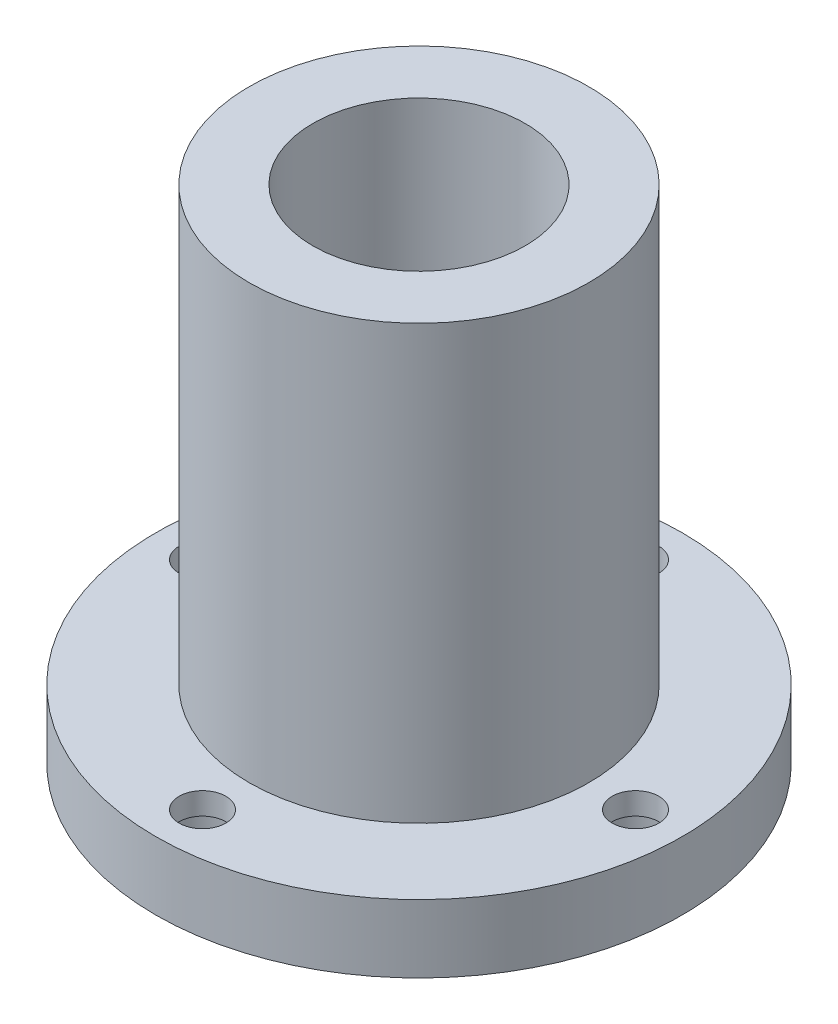
ISO-10303-21;
HEADER;
FILE_DESCRIPTION(('STEP AP214'),'2;1');
FILE_NAME('part.step','',(''),(''),'','','');
FILE_SCHEMA(('AUTOMOTIVE_DESIGN { 1 0 10303 214 1 1 1 1 }'));
ENDSEC;
DATA;
#1=APPLICATION_CONTEXT('core data for automotive mechanical design processes');
#2=APPLICATION_PROTOCOL_DEFINITION('international standard','automotive_design',2000,#1);
#3=PRODUCT_CONTEXT('',#1,'mechanical');
#4=PRODUCT('Part','Part','',(#3));
#5=PRODUCT_RELATED_PRODUCT_CATEGORY('part','',(#4));
#6=PRODUCT_DEFINITION_FORMATION('','',#4);
#7=PRODUCT_DEFINITION_CONTEXT('part definition',#1,'design');
#8=PRODUCT_DEFINITION('design','',#6,#7);
#9=PRODUCT_DEFINITION_SHAPE('','',#8);
#10=(LENGTH_UNIT() NAMED_UNIT(*) SI_UNIT(.MILLI.,.METRE.));
#11=(NAMED_UNIT(*) PLANE_ANGLE_UNIT() SI_UNIT($,.RADIAN.));
#12=(NAMED_UNIT(*) SI_UNIT($,.STERADIAN.) SOLID_ANGLE_UNIT());
#13=UNCERTAINTY_MEASURE_WITH_UNIT(LENGTH_MEASURE(1.E-05),#10,'distance_accuracy_value','');
#14=(GEOMETRIC_REPRESENTATION_CONTEXT(3) GLOBAL_UNCERTAINTY_ASSIGNED_CONTEXT((#13)) GLOBAL_UNIT_ASSIGNED_CONTEXT((#10,
#11,#12)) REPRESENTATION_CONTEXT('',''));
#15=CARTESIAN_POINT('',(0.,0.,0.));
#16=DIRECTION('',(0.,0.,1.));
#17=DIRECTION('',(1.,0.,0.));
#18=AXIS2_PLACEMENT_3D('',#15,#16,#17);
#19=CARTESIAN_POINT('',(0.,8.,0.));
#20=DIRECTION('',(0.,-1.,0.));
#21=DIRECTION('',(0.,0.,-1.));
#22=AXIS2_PLACEMENT_3D('',#19,#20,#21);
#23=CYLINDRICAL_SURFACE('',#22,31.);
#24=CARTESIAN_POINT('',(0.,8.,0.));
#25=DIRECTION('',(0.,1.,0.));
#26=DIRECTION('',(0.,0.,1.));
#27=AXIS2_PLACEMENT_3D('',#24,#25,#26);
#28=CIRCLE('',#27,31.);
#29=CARTESIAN_POINT('',(0.,8.,31.));
#30=VERTEX_POINT('',#29);
#31=EDGE_CURVE('E45',#30,#30,#28,.T.);
#32=ORIENTED_EDGE('',*,*,#31,.F.);
#33=EDGE_LOOP('',(#32));
#34=FACE_BOUND('',#33,.T.);
#35=CARTESIAN_POINT('',(0.,0.,0.));
#36=DIRECTION('',(0.,1.,0.));
#37=DIRECTION('',(0.,0.,1.));
#38=AXIS2_PLACEMENT_3D('',#35,#36,#37);
#39=CIRCLE('',#38,31.);
#40=CARTESIAN_POINT('',(0.,0.,31.));
#41=VERTEX_POINT('',#40);
#42=EDGE_CURVE('E51',#41,#41,#39,.T.);
#43=ORIENTED_EDGE('',*,*,#42,.T.);
#44=EDGE_LOOP('',(#43));
#45=FACE_BOUND('',#44,.T.);
#46=ADVANCED_FACE('F37',(#34,#45),#23,.T.);
#47=CARTESIAN_POINT('',(0.,8.,0.));
#48=DIRECTION('',(0.,1.,0.));
#49=DIRECTION('',(0.,0.,1.));
#50=AXIS2_PLACEMENT_3D('',#47,#48,#49);
#51=PLANE('',#50);
#52=CARTESIAN_POINT('',(25.5,8.,0.));
#53=DIRECTION('',(0.,1.,0.));
#54=DIRECTION('',(0.,0.,1.));
#55=AXIS2_PLACEMENT_3D('',#52,#53,#54);
#56=CIRCLE('',#55,2.75);
#57=CARTESIAN_POINT('',(25.5,8.,2.75));
#58=VERTEX_POINT('',#57);
#59=EDGE_CURVE('E40',#58,#58,#56,.T.);
#60=ORIENTED_EDGE('',*,*,#59,.F.);
#61=EDGE_LOOP('',(#60));
#62=FACE_BOUND('',#61,.T.);
#63=CARTESIAN_POINT('',(0.,8.,-25.5));
#64=DIRECTION('',(0.,1.,0.));
#65=DIRECTION('',(0.,0.,1.));
#66=AXIS2_PLACEMENT_3D('',#63,#64,#65);
#67=CIRCLE('',#66,2.75);
#68=CARTESIAN_POINT('',(0.,8.,-22.75));
#69=VERTEX_POINT('',#68);
#70=EDGE_CURVE('E68',#69,#69,#67,.T.);
#71=ORIENTED_EDGE('',*,*,#70,.F.);
#72=EDGE_LOOP('',(#71));
#73=FACE_BOUND('',#72,.T.);
#74=CARTESIAN_POINT('',(-25.5,8.,0.));
#75=DIRECTION('',(0.,1.,0.));
#76=DIRECTION('',(0.,0.,1.));
#77=AXIS2_PLACEMENT_3D('',#74,#75,#76);
#78=CIRCLE('',#77,2.75);
#79=CARTESIAN_POINT('',(-25.5,8.,2.75));
#80=VERTEX_POINT('',#79);
#81=EDGE_CURVE('E64',#80,#80,#78,.T.);
#82=ORIENTED_EDGE('',*,*,#81,.F.);
#83=EDGE_LOOP('',(#82));
#84=FACE_BOUND('',#83,.T.);
#85=CARTESIAN_POINT('',(0.,8.,25.5));
#86=DIRECTION('',(0.,1.,0.));
#87=DIRECTION('',(0.,0.,1.));
#88=AXIS2_PLACEMENT_3D('',#85,#86,#87);
#89=CIRCLE('',#88,2.75);
#90=CARTESIAN_POINT('',(0.,8.,28.25));
#91=VERTEX_POINT('',#90);
#92=EDGE_CURVE('E60',#91,#91,#89,.T.);
#93=ORIENTED_EDGE('',*,*,#92,.F.);
#94=EDGE_LOOP('',(#93));
#95=FACE_BOUND('',#94,.T.);
#96=CARTESIAN_POINT('',(0.,8.,0.));
#97=DIRECTION('',(0.,1.,0.));
#98=DIRECTION('',(0.,0.,1.));
#99=AXIS2_PLACEMENT_3D('',#96,#97,#98);
#100=CIRCLE('',#99,20.);
#101=CARTESIAN_POINT('',(0.,8.,20.));
#102=VERTEX_POINT('',#101);
#103=EDGE_CURVE('E10',#102,#102,#100,.T.);
#104=ORIENTED_EDGE('',*,*,#103,.F.);
#105=EDGE_LOOP('',(#104));
#106=FACE_BOUND('',#105,.T.);
#107=ORIENTED_EDGE('',*,*,#31,.T.);
#108=EDGE_LOOP('',(#107));
#109=FACE_BOUND('',#108,.T.);
#110=ADVANCED_FACE('F133',(#62,#73,#84,#95,#106,#109),#51,.T.);
#111=CARTESIAN_POINT('',(0.,0.,0.));
#112=DIRECTION('',(0.,1.,0.));
#113=DIRECTION('',(0.,0.,1.));
#114=AXIS2_PLACEMENT_3D('',#111,#112,#113);
#115=PLANE('',#114);
#116=CARTESIAN_POINT('',(0.,0.,-25.5));
#117=DIRECTION('',(0.,-1.,0.));
#118=DIRECTION('',(0.,0.,-1.));
#119=AXIS2_PLACEMENT_3D('',#116,#117,#118);
#120=CIRCLE('',#119,4.6);
#121=CARTESIAN_POINT('',(0.,0.,-30.1));
#122=VERTEX_POINT('',#121);
#123=EDGE_CURVE('E101',#122,#122,#120,.T.);
#124=ORIENTED_EDGE('',*,*,#123,.F.);
#125=EDGE_LOOP('',(#124));
#126=FACE_BOUND('',#125,.T.);
#127=CARTESIAN_POINT('',(-25.5,0.,0.));
#128=DIRECTION('',(0.,-1.,0.));
#129=DIRECTION('',(0.,0.,-1.));
#130=AXIS2_PLACEMENT_3D('',#127,#128,#129);
#131=CIRCLE('',#130,4.6);
#132=CARTESIAN_POINT('',(-25.5,0.,-4.6));
#133=VERTEX_POINT('',#132);
#134=EDGE_CURVE('E116',#133,#133,#131,.T.);
#135=ORIENTED_EDGE('',*,*,#134,.F.);
#136=EDGE_LOOP('',(#135));
#137=FACE_BOUND('',#136,.T.);
#138=CARTESIAN_POINT('',(0.,0.,25.5));
#139=DIRECTION('',(0.,-1.,0.));
#140=DIRECTION('',(0.,0.,-1.));
#141=AXIS2_PLACEMENT_3D('',#138,#139,#140);
#142=CIRCLE('',#141,4.6);
#143=CARTESIAN_POINT('',(0.,0.,20.9));
#144=VERTEX_POINT('',#143);
#145=EDGE_CURVE('E86',#144,#144,#142,.T.);
#146=ORIENTED_EDGE('',*,*,#145,.F.);
#147=EDGE_LOOP('',(#146));
#148=FACE_BOUND('',#147,.T.);
#149=CARTESIAN_POINT('',(25.5,0.,0.));
#150=DIRECTION('',(0.,-1.,0.));
#151=DIRECTION('',(0.,0.,-1.));
#152=AXIS2_PLACEMENT_3D('',#149,#150,#151);
#153=CIRCLE('',#152,4.6);
#154=CARTESIAN_POINT('',(25.5,0.,-4.6));
#155=VERTEX_POINT('',#154);
#156=EDGE_CURVE('E75',#155,#155,#153,.T.);
#157=ORIENTED_EDGE('',*,*,#156,.F.);
#158=EDGE_LOOP('',(#157));
#159=FACE_BOUND('',#158,.T.);
#160=CARTESIAN_POINT('',(0.,0.,0.));
#161=DIRECTION('',(0.,1.,0.));
#162=DIRECTION('',(0.,0.,1.));
#163=AXIS2_PLACEMENT_3D('',#160,#161,#162);
#164=CIRCLE('',#163,12.5);
#165=CARTESIAN_POINT('',(0.,0.,12.5));
#166=VERTEX_POINT('',#165);
#167=EDGE_CURVE('E90',#166,#166,#164,.T.);
#168=ORIENTED_EDGE('',*,*,#167,.T.);
#169=EDGE_LOOP('',(#168));
#170=FACE_BOUND('',#169,.T.);
#171=ORIENTED_EDGE('',*,*,#42,.F.);
#172=EDGE_LOOP('',(#171));
#173=FACE_BOUND('',#172,.T.);
#174=ADVANCED_FACE('F129',(#126,#137,#148,#159,#170,#173),#115,.F.);
#175=CARTESIAN_POINT('',(0.,59.,0.));
#176=DIRECTION('',(0.,-1.,0.));
#177=DIRECTION('',(0.,0.,-1.));
#178=AXIS2_PLACEMENT_3D('',#175,#176,#177);
#179=CYLINDRICAL_SURFACE('',#178,20.);
#180=CARTESIAN_POINT('',(0.,59.,0.));
#181=DIRECTION('',(0.,1.,0.));
#182=DIRECTION('',(0.,0.,1.));
#183=AXIS2_PLACEMENT_3D('',#180,#181,#182);
#184=CIRCLE('',#183,20.);
#185=CARTESIAN_POINT('',(0.,59.,20.));
#186=VERTEX_POINT('',#185);
#187=EDGE_CURVE('E54',#186,#186,#184,.T.);
#188=ORIENTED_EDGE('',*,*,#187,.F.);
#189=EDGE_LOOP('',(#188));
#190=FACE_BOUND('',#189,.T.);
#191=ORIENTED_EDGE('',*,*,#103,.T.);
#192=EDGE_LOOP('',(#191));
#193=FACE_BOUND('',#192,.T.);
#194=ADVANCED_FACE('F132',(#190,#193),#179,.T.);
#195=CARTESIAN_POINT('',(0.,59.,0.));
#196=DIRECTION('',(0.,1.,0.));
#197=DIRECTION('',(0.,0.,1.));
#198=AXIS2_PLACEMENT_3D('',#195,#196,#197);
#199=PLANE('',#198);
#200=CARTESIAN_POINT('',(0.,59.,0.));
#201=DIRECTION('',(0.,1.,0.));
#202=DIRECTION('',(0.,0.,1.));
#203=AXIS2_PLACEMENT_3D('',#200,#201,#202);
#204=CIRCLE('',#203,12.5);
#205=CARTESIAN_POINT('',(0.,59.,12.5));
#206=VERTEX_POINT('',#205);
#207=EDGE_CURVE('E93',#206,#206,#204,.T.);
#208=ORIENTED_EDGE('',*,*,#207,.F.);
#209=EDGE_LOOP('',(#208));
#210=FACE_BOUND('',#209,.T.);
#211=ORIENTED_EDGE('',*,*,#187,.T.);
#212=EDGE_LOOP('',(#211));
#213=FACE_BOUND('',#212,.T.);
#214=ADVANCED_FACE('F155',(#210,#213),#199,.T.);
#215=CARTESIAN_POINT('',(0.,0.,0.));
#216=DIRECTION('',(0.,1.,0.));
#217=DIRECTION('',(0.,0.,1.));
#218=AXIS2_PLACEMENT_3D('',#215,#216,#217);
#219=CYLINDRICAL_SURFACE('',#218,12.5);
#220=ORIENTED_EDGE('',*,*,#167,.F.);
#221=EDGE_LOOP('',(#220));
#222=FACE_BOUND('',#221,.T.);
#223=ORIENTED_EDGE('',*,*,#207,.T.);
#224=EDGE_LOOP('',(#223));
#225=FACE_BOUND('',#224,.T.);
#226=ADVANCED_FACE('F159',(#222,#225),#219,.F.);
#227=CARTESIAN_POINT('',(25.5,5.4,0.));
#228=DIRECTION('',(0.,-1.,0.));
#229=DIRECTION('',(0.,0.,-1.));
#230=AXIS2_PLACEMENT_3D('',#227,#228,#229);
#231=CYLINDRICAL_SURFACE('',#230,4.6);
#232=CARTESIAN_POINT('',(25.5,5.4,0.));
#233=DIRECTION('',(0.,-1.,0.));
#234=DIRECTION('',(0.,0.,-1.));
#235=AXIS2_PLACEMENT_3D('',#232,#233,#234);
#236=CIRCLE('',#235,4.6);
#237=CARTESIAN_POINT('',(25.5,5.4,-4.6));
#238=VERTEX_POINT('',#237);
#239=EDGE_CURVE('E80',#238,#238,#236,.T.);
#240=CARTESIAN_POINT('',(25.5,5.4,-4.6));
#241=CARTESIAN_POINT('',(25.5,5.34375,-4.6));
#242=CARTESIAN_POINT('',(25.5,5.2875,-4.6));
#243=CARTESIAN_POINT('',(25.5,5.175,-4.6));
#244=CARTESIAN_POINT('',(25.5,5.11875,-4.6));
#245=CARTESIAN_POINT('',(25.5,5.00625,-4.6));
#246=CARTESIAN_POINT('',(25.5,4.95,-4.6));
#247=CARTESIAN_POINT('',(25.5,4.8375,-4.6));
#248=CARTESIAN_POINT('',(25.5,4.78125,-4.6));
#249=CARTESIAN_POINT('',(25.5,4.66875,-4.6));
#250=CARTESIAN_POINT('',(25.5,4.6125,-4.6));
#251=CARTESIAN_POINT('',(25.5,4.5,-4.6));
#252=CARTESIAN_POINT('',(25.5,4.44375,-4.6));
#253=CARTESIAN_POINT('',(25.5,4.33125,-4.6));
#254=CARTESIAN_POINT('',(25.5,4.275,-4.6));
#255=CARTESIAN_POINT('',(25.5,4.1625,-4.6));
#256=CARTESIAN_POINT('',(25.5,4.10625,-4.6));
#257=CARTESIAN_POINT('',(25.5,3.99375,-4.6));
#258=CARTESIAN_POINT('',(25.5,3.9375,-4.6));
#259=CARTESIAN_POINT('',(25.5,3.825,-4.6));
#260=CARTESIAN_POINT('',(25.5,3.76875,-4.6));
#261=CARTESIAN_POINT('',(25.5,3.65625,-4.6));
#262=CARTESIAN_POINT('',(25.5,3.6,-4.6));
#263=CARTESIAN_POINT('',(25.5,3.4875,-4.6));
#264=CARTESIAN_POINT('',(25.5,3.43125,-4.6));
#265=CARTESIAN_POINT('',(25.5,3.31875,-4.6));
#266=CARTESIAN_POINT('',(25.5,3.2625,-4.6));
#267=CARTESIAN_POINT('',(25.5,3.15,-4.6));
#268=CARTESIAN_POINT('',(25.5,3.09375,-4.6));
#269=CARTESIAN_POINT('',(25.5,2.98125,-4.6));
#270=CARTESIAN_POINT('',(25.5,2.925,-4.6));
#271=CARTESIAN_POINT('',(25.5,2.8125,-4.6));
#272=CARTESIAN_POINT('',(25.5,2.75625,-4.6));
#273=CARTESIAN_POINT('',(25.5,2.64375,-4.6));
#274=CARTESIAN_POINT('',(25.5,2.5875,-4.6));
#275=CARTESIAN_POINT('',(25.5,2.475,-4.6));
#276=CARTESIAN_POINT('',(25.5,2.41875,-4.6));
#277=CARTESIAN_POINT('',(25.5,2.30625,-4.6));
#278=CARTESIAN_POINT('',(25.5,2.25,-4.6));
#279=CARTESIAN_POINT('',(25.5,2.1375,-4.6));
#280=CARTESIAN_POINT('',(25.5,2.08125,-4.6));
#281=CARTESIAN_POINT('',(25.5,1.96875,-4.6));
#282=CARTESIAN_POINT('',(25.5,1.9125,-4.6));
#283=CARTESIAN_POINT('',(25.5,1.8,-4.6));
#284=CARTESIAN_POINT('',(25.5,1.74375,-4.6));
#285=CARTESIAN_POINT('',(25.5,1.63125,-4.6));
#286=CARTESIAN_POINT('',(25.5,1.575,-4.6));
#287=CARTESIAN_POINT('',(25.5,1.4625,-4.6));
#288=CARTESIAN_POINT('',(25.5,1.40625,-4.6));
#289=CARTESIAN_POINT('',(25.5,1.29375,-4.6));
#290=CARTESIAN_POINT('',(25.5,1.2375,-4.6));
#291=CARTESIAN_POINT('',(25.5,1.125,-4.6));
#292=CARTESIAN_POINT('',(25.5,1.06875,-4.6));
#293=CARTESIAN_POINT('',(25.5,0.956250000000001,-4.6));
#294=CARTESIAN_POINT('',(25.5,0.900000000000001,-4.6));
#295=CARTESIAN_POINT('',(25.5,0.787500000000001,-4.6));
#296=CARTESIAN_POINT('',(25.5,0.731250000000001,-4.6));
#297=CARTESIAN_POINT('',(25.5,0.618750000000001,-4.6));
#298=CARTESIAN_POINT('',(25.5,0.562500000000001,-4.6));
#299=CARTESIAN_POINT('',(25.5,0.450000000000001,-4.6));
#300=CARTESIAN_POINT('',(25.5,0.393750000000001,-4.6));
#301=CARTESIAN_POINT('',(25.5,0.281250000000001,-4.6));
#302=CARTESIAN_POINT('',(25.5,0.225000000000001,-4.6));
#303=CARTESIAN_POINT('',(25.5,0.112500000000001,-4.6));
#304=CARTESIAN_POINT('',(25.5,0.0562500000000007,-4.6));
#305=CARTESIAN_POINT('',(25.5,0.,-4.6));
#306=B_SPLINE_CURVE_WITH_KNOTS('',3,(#240,#241,#242,#243,#244,#245,#246,#247,#248,#249,#250,
#251,#252,#253,#254,#255,#256,#257,#258,#259,#260,#261,#262,#263,#264,#265,#266,#267,#268,#269,
#270,#271,#272,#273,#274,#275,#276,#277,#278,#279,#280,#281,#282,#283,#284,#285,#286,#287,#288,
#289,#290,#291,#292,#293,#294,#295,#296,#297,#298,#299,#300,#301,#302,#303,#304,#305),
.UNSPECIFIED.,.F.,.F.,(4,2,2,2,2,2,2,2,2,2,2,2,2,2,2,2,2,2,2,2,2,2,2,2,2,2,2,2,2,2,2,2,4),(0.,
0.16875,0.337499999999999,0.50625,0.674999999999999,0.84375,1.0125,1.18125,1.35,1.51875,1.6875,
1.85625,2.025,2.19375,2.3625,2.53125,2.7,2.86875,3.0375,3.20625,3.375,3.54375,3.7125,3.88125,
4.05,4.21875,4.3875,4.55625,4.725,4.89375,5.0625,5.23125,5.4),.UNSPECIFIED.);
#307=EDGE_CURVE('BSEAM163',#238,#155,#306,.T.);
#308=ORIENTED_EDGE('',*,*,#239,.F.);
#309=ORIENTED_EDGE('',*,*,#156,.T.);
#310=ORIENTED_EDGE('',*,*,#307,.T.);
#311=ORIENTED_EDGE('',*,*,#307,.F.);
#312=EDGE_LOOP('',(#308,#310,#309,#311));
#313=FACE_BOUND('',#312,.T.);
#314=ADVANCED_FACE('F163',(#313),#231,.F.);
#315=CARTESIAN_POINT('',(25.5,5.4,0.));
#316=DIRECTION('',(0.,-1.,0.));
#317=DIRECTION('',(0.,0.,-1.));
#318=AXIS2_PLACEMENT_3D('',#315,#316,#317);
#319=PLANE('',#318);
#320=CARTESIAN_POINT('',(25.5,5.4,0.));
#321=DIRECTION('',(0.,-1.,0.));
#322=DIRECTION('',(0.,0.,-1.));
#323=AXIS2_PLACEMENT_3D('',#320,#321,#322);
#324=CIRCLE('',#323,2.75);
#325=CARTESIAN_POINT('',(25.5,5.4,-2.75));
#326=VERTEX_POINT('',#325);
#327=EDGE_CURVE('E65',#326,#326,#324,.T.);
#328=ORIENTED_EDGE('',*,*,#327,.F.);
#329=EDGE_LOOP('',(#328));
#330=FACE_BOUND('',#329,.T.);
#331=ORIENTED_EDGE('',*,*,#239,.T.);
#332=EDGE_LOOP('',(#331));
#333=FACE_BOUND('',#332,.T.);
#334=ADVANCED_FACE('F167',(#330,#333),#319,.T.);
#335=CARTESIAN_POINT('',(0.,5.4,25.5));
#336=DIRECTION('',(0.,-1.,0.));
#337=DIRECTION('',(0.,0.,-1.));
#338=AXIS2_PLACEMENT_3D('',#335,#336,#337);
#339=CYLINDRICAL_SURFACE('',#338,4.6);
#340=CARTESIAN_POINT('',(0.,5.4,25.5));
#341=DIRECTION('',(0.,-1.,0.));
#342=DIRECTION('',(0.,0.,-1.));
#343=AXIS2_PLACEMENT_3D('',#340,#341,#342);
#344=CIRCLE('',#343,4.6);
#345=CARTESIAN_POINT('',(0.,5.4,20.9));
#346=VERTEX_POINT('',#345);
#347=EDGE_CURVE('E120',#346,#346,#344,.T.);
#348=CARTESIAN_POINT('',(0.,5.4,20.9));
#349=CARTESIAN_POINT('',(0.,5.34375,20.9));
#350=CARTESIAN_POINT('',(0.,5.2875,20.9));
#351=CARTESIAN_POINT('',(0.,5.175,20.9));
#352=CARTESIAN_POINT('',(0.,5.11875,20.9));
#353=CARTESIAN_POINT('',(0.,5.00625,20.9));
#354=CARTESIAN_POINT('',(0.,4.95,20.9));
#355=CARTESIAN_POINT('',(0.,4.8375,20.9));
#356=CARTESIAN_POINT('',(0.,4.78125,20.9));
#357=CARTESIAN_POINT('',(0.,4.66875,20.9));
#358=CARTESIAN_POINT('',(0.,4.6125,20.9));
#359=CARTESIAN_POINT('',(0.,4.5,20.9));
#360=CARTESIAN_POINT('',(0.,4.44375,20.9));
#361=CARTESIAN_POINT('',(0.,4.33125,20.9));
#362=CARTESIAN_POINT('',(0.,4.275,20.9));
#363=CARTESIAN_POINT('',(0.,4.1625,20.9));
#364=CARTESIAN_POINT('',(0.,4.10625,20.9));
#365=CARTESIAN_POINT('',(0.,3.99375,20.9));
#366=CARTESIAN_POINT('',(0.,3.9375,20.9));
#367=CARTESIAN_POINT('',(0.,3.825,20.9));
#368=CARTESIAN_POINT('',(0.,3.76875,20.9));
#369=CARTESIAN_POINT('',(0.,3.65625,20.9));
#370=CARTESIAN_POINT('',(0.,3.6,20.9));
#371=CARTESIAN_POINT('',(0.,3.4875,20.9));
#372=CARTESIAN_POINT('',(0.,3.43125,20.9));
#373=CARTESIAN_POINT('',(0.,3.31875,20.9));
#374=CARTESIAN_POINT('',(0.,3.2625,20.9));
#375=CARTESIAN_POINT('',(0.,3.15,20.9));
#376=CARTESIAN_POINT('',(0.,3.09375,20.9));
#377=CARTESIAN_POINT('',(0.,2.98125,20.9));
#378=CARTESIAN_POINT('',(0.,2.925,20.9));
#379=CARTESIAN_POINT('',(0.,2.8125,20.9));
#380=CARTESIAN_POINT('',(0.,2.75625,20.9));
#381=CARTESIAN_POINT('',(0.,2.64375,20.9));
#382=CARTESIAN_POINT('',(0.,2.5875,20.9));
#383=CARTESIAN_POINT('',(0.,2.475,20.9));
#384=CARTESIAN_POINT('',(0.,2.41875,20.9));
#385=CARTESIAN_POINT('',(0.,2.30625,20.9));
#386=CARTESIAN_POINT('',(0.,2.25,20.9));
#387=CARTESIAN_POINT('',(0.,2.1375,20.9));
#388=CARTESIAN_POINT('',(0.,2.08125,20.9));
#389=CARTESIAN_POINT('',(0.,1.96875,20.9));
#390=CARTESIAN_POINT('',(0.,1.9125,20.9));
#391=CARTESIAN_POINT('',(0.,1.8,20.9));
#392=CARTESIAN_POINT('',(0.,1.74375,20.9));
#393=CARTESIAN_POINT('',(0.,1.63125,20.9));
#394=CARTESIAN_POINT('',(0.,1.575,20.9));
#395=CARTESIAN_POINT('',(0.,1.4625,20.9));
#396=CARTESIAN_POINT('',(0.,1.40625,20.9));
#397=CARTESIAN_POINT('',(0.,1.29375,20.9));
#398=CARTESIAN_POINT('',(0.,1.2375,20.9));
#399=CARTESIAN_POINT('',(0.,1.125,20.9));
#400=CARTESIAN_POINT('',(0.,1.06875,20.9));
#401=CARTESIAN_POINT('',(0.,0.956250000000001,20.9));
#402=CARTESIAN_POINT('',(0.,0.900000000000001,20.9));
#403=CARTESIAN_POINT('',(0.,0.787500000000001,20.9));
#404=CARTESIAN_POINT('',(0.,0.731250000000001,20.9));
#405=CARTESIAN_POINT('',(0.,0.618750000000001,20.9));
#406=CARTESIAN_POINT('',(0.,0.562500000000001,20.9));
#407=CARTESIAN_POINT('',(0.,0.450000000000001,20.9));
#408=CARTESIAN_POINT('',(0.,0.393750000000001,20.9));
#409=CARTESIAN_POINT('',(0.,0.281250000000001,20.9));
#410=CARTESIAN_POINT('',(0.,0.225000000000001,20.9));
#411=CARTESIAN_POINT('',(0.,0.112500000000001,20.9));
#412=CARTESIAN_POINT('',(0.,0.0562500000000007,20.9));
#413=CARTESIAN_POINT('',(0.,0.,20.9));
#414=B_SPLINE_CURVE_WITH_KNOTS('',3,(#348,#349,#350,#351,#352,#353,#354,#355,#356,#357,#358,
#359,#360,#361,#362,#363,#364,#365,#366,#367,#368,#369,#370,#371,#372,#373,#374,#375,#376,#377,
#378,#379,#380,#381,#382,#383,#384,#385,#386,#387,#388,#389,#390,#391,#392,#393,#394,#395,#396,
#397,#398,#399,#400,#401,#402,#403,#404,#405,#406,#407,#408,#409,#410,#411,#412,#413),
.UNSPECIFIED.,.F.,.F.,(4,2,2,2,2,2,2,2,2,2,2,2,2,2,2,2,2,2,2,2,2,2,2,2,2,2,2,2,2,2,2,2,4),(0.,
0.16875,0.337499999999999,0.50625,0.674999999999999,0.84375,1.0125,1.18125,1.35,1.51875,1.6875,
1.85625,2.025,2.19375,2.3625,2.53125,2.7,2.86875,3.0375,3.20625,3.375,3.54375,3.7125,3.88125,
4.05,4.21875,4.3875,4.55625,4.725,4.89375,5.0625,5.23125,5.4),.UNSPECIFIED.);
#415=EDGE_CURVE('BSEAM127',#346,#144,#414,.T.);
#416=ORIENTED_EDGE('',*,*,#347,.F.);
#417=ORIENTED_EDGE('',*,*,#145,.T.);
#418=ORIENTED_EDGE('',*,*,#415,.T.);
#419=ORIENTED_EDGE('',*,*,#415,.F.);
#420=EDGE_LOOP('',(#416,#418,#417,#419));
#421=FACE_BOUND('',#420,.T.);
#422=ADVANCED_FACE('F127',(#421),#339,.F.);
#423=CARTESIAN_POINT('',(0.,5.4,25.5));
#424=DIRECTION('',(0.,-1.,0.));
#425=DIRECTION('',(0.,0.,-1.));
#426=AXIS2_PLACEMENT_3D('',#423,#424,#425);
#427=PLANE('',#426);
#428=CARTESIAN_POINT('',(0.,5.4,25.5));
#429=DIRECTION('',(0.,-1.,0.));
#430=DIRECTION('',(0.,0.,-1.));
#431=AXIS2_PLACEMENT_3D('',#428,#429,#430);
#432=CIRCLE('',#431,2.75);
#433=CARTESIAN_POINT('',(0.,5.4,22.75));
#434=VERTEX_POINT('',#433);
#435=EDGE_CURVE('E110',#434,#434,#432,.T.);
#436=ORIENTED_EDGE('',*,*,#435,.F.);
#437=EDGE_LOOP('',(#436));
#438=FACE_BOUND('',#437,.T.);
#439=ORIENTED_EDGE('',*,*,#347,.T.);
#440=EDGE_LOOP('',(#439));
#441=FACE_BOUND('',#440,.T.);
#442=ADVANCED_FACE('F174',(#438,#441),#427,.T.);
#443=CARTESIAN_POINT('',(-25.5,5.4,0.));
#444=DIRECTION('',(0.,-1.,0.));
#445=DIRECTION('',(0.,0.,-1.));
#446=AXIS2_PLACEMENT_3D('',#443,#444,#445);
#447=CYLINDRICAL_SURFACE('',#446,4.6);
#448=CARTESIAN_POINT('',(-25.5,5.4,0.));
#449=DIRECTION('',(0.,-1.,0.));
#450=DIRECTION('',(0.,0.,-1.));
#451=AXIS2_PLACEMENT_3D('',#448,#449,#450);
#452=CIRCLE('',#451,4.6);
#453=CARTESIAN_POINT('',(-25.5,5.4,-4.6));
#454=VERTEX_POINT('',#453);
#455=EDGE_CURVE('E107',#454,#454,#452,.T.);
#456=CARTESIAN_POINT('',(-25.5,5.4,-4.6));
#457=CARTESIAN_POINT('',(-25.5,5.34375,-4.6));
#458=CARTESIAN_POINT('',(-25.5,5.2875,-4.6));
#459=CARTESIAN_POINT('',(-25.5,5.175,-4.6));
#460=CARTESIAN_POINT('',(-25.5,5.11875,-4.6));
#461=CARTESIAN_POINT('',(-25.5,5.00625,-4.6));
#462=CARTESIAN_POINT('',(-25.5,4.95,-4.6));
#463=CARTESIAN_POINT('',(-25.5,4.8375,-4.6));
#464=CARTESIAN_POINT('',(-25.5,4.78125,-4.6));
#465=CARTESIAN_POINT('',(-25.5,4.66875,-4.6));
#466=CARTESIAN_POINT('',(-25.5,4.6125,-4.6));
#467=CARTESIAN_POINT('',(-25.5,4.5,-4.6));
#468=CARTESIAN_POINT('',(-25.5,4.44375,-4.6));
#469=CARTESIAN_POINT('',(-25.5,4.33125,-4.6));
#470=CARTESIAN_POINT('',(-25.5,4.275,-4.6));
#471=CARTESIAN_POINT('',(-25.5,4.1625,-4.6));
#472=CARTESIAN_POINT('',(-25.5,4.10625,-4.6));
#473=CARTESIAN_POINT('',(-25.5,3.99375,-4.6));
#474=CARTESIAN_POINT('',(-25.5,3.9375,-4.6));
#475=CARTESIAN_POINT('',(-25.5,3.825,-4.6));
#476=CARTESIAN_POINT('',(-25.5,3.76875,-4.6));
#477=CARTESIAN_POINT('',(-25.5,3.65625,-4.6));
#478=CARTESIAN_POINT('',(-25.5,3.6,-4.6));
#479=CARTESIAN_POINT('',(-25.5,3.4875,-4.6));
#480=CARTESIAN_POINT('',(-25.5,3.43125,-4.6));
#481=CARTESIAN_POINT('',(-25.5,3.31875,-4.6));
#482=CARTESIAN_POINT('',(-25.5,3.2625,-4.6));
#483=CARTESIAN_POINT('',(-25.5,3.15,-4.6));
#484=CARTESIAN_POINT('',(-25.5,3.09375,-4.6));
#485=CARTESIAN_POINT('',(-25.5,2.98125,-4.6));
#486=CARTESIAN_POINT('',(-25.5,2.925,-4.6));
#487=CARTESIAN_POINT('',(-25.5,2.8125,-4.6));
#488=CARTESIAN_POINT('',(-25.5,2.75625,-4.6));
#489=CARTESIAN_POINT('',(-25.5,2.64375,-4.6));
#490=CARTESIAN_POINT('',(-25.5,2.5875,-4.6));
#491=CARTESIAN_POINT('',(-25.5,2.475,-4.6));
#492=CARTESIAN_POINT('',(-25.5,2.41875,-4.6));
#493=CARTESIAN_POINT('',(-25.5,2.30625,-4.6));
#494=CARTESIAN_POINT('',(-25.5,2.25,-4.6));
#495=CARTESIAN_POINT('',(-25.5,2.1375,-4.6));
#496=CARTESIAN_POINT('',(-25.5,2.08125,-4.6));
#497=CARTESIAN_POINT('',(-25.5,1.96875,-4.6));
#498=CARTESIAN_POINT('',(-25.5,1.9125,-4.6));
#499=CARTESIAN_POINT('',(-25.5,1.8,-4.6));
#500=CARTESIAN_POINT('',(-25.5,1.74375,-4.6));
#501=CARTESIAN_POINT('',(-25.5,1.63125,-4.6));
#502=CARTESIAN_POINT('',(-25.5,1.575,-4.6));
#503=CARTESIAN_POINT('',(-25.5,1.4625,-4.6));
#504=CARTESIAN_POINT('',(-25.5,1.40625,-4.6));
#505=CARTESIAN_POINT('',(-25.5,1.29375,-4.6));
#506=CARTESIAN_POINT('',(-25.5,1.2375,-4.6));
#507=CARTESIAN_POINT('',(-25.5,1.125,-4.6));
#508=CARTESIAN_POINT('',(-25.5,1.06875,-4.6));
#509=CARTESIAN_POINT('',(-25.5,0.956250000000001,-4.6));
#510=CARTESIAN_POINT('',(-25.5,0.900000000000001,-4.6));
#511=CARTESIAN_POINT('',(-25.5,0.787500000000001,-4.6));
#512=CARTESIAN_POINT('',(-25.5,0.731250000000001,-4.6));
#513=CARTESIAN_POINT('',(-25.5,0.618750000000001,-4.6));
#514=CARTESIAN_POINT('',(-25.5,0.562500000000001,-4.6));
#515=CARTESIAN_POINT('',(-25.5,0.450000000000001,-4.6));
#516=CARTESIAN_POINT('',(-25.5,0.393750000000001,-4.6));
#517=CARTESIAN_POINT('',(-25.5,0.281250000000001,-4.6));
#518=CARTESIAN_POINT('',(-25.5,0.225000000000001,-4.6));
#519=CARTESIAN_POINT('',(-25.5,0.112500000000001,-4.6));
#520=CARTESIAN_POINT('',(-25.5,0.0562500000000007,-4.6));
#521=CARTESIAN_POINT('',(-25.5,0.,-4.6));
#522=B_SPLINE_CURVE_WITH_KNOTS('',3,(#456,#457,#458,#459,#460,#461,#462,#463,#464,#465,#466,
#467,#468,#469,#470,#471,#472,#473,#474,#475,#476,#477,#478,#479,#480,#481,#482,#483,#484,#485,
#486,#487,#488,#489,#490,#491,#492,#493,#494,#495,#496,#497,#498,#499,#500,#501,#502,#503,#504,
#505,#506,#507,#508,#509,#510,#511,#512,#513,#514,#515,#516,#517,#518,#519,#520,#521),
.UNSPECIFIED.,.F.,.F.,(4,2,2,2,2,2,2,2,2,2,2,2,2,2,2,2,2,2,2,2,2,2,2,2,2,2,2,2,2,2,2,2,4),(0.,
0.16875,0.337499999999999,0.50625,0.674999999999999,0.84375,1.0125,1.18125,1.35,1.51875,1.6875,
1.85625,2.025,2.19375,2.3625,2.53125,2.7,2.86875,3.0375,3.20625,3.375,3.54375,3.7125,3.88125,
4.05,4.21875,4.3875,4.55625,4.725,4.89375,5.0625,5.23125,5.4),.UNSPECIFIED.);
#523=EDGE_CURVE('BSEAM178',#454,#133,#522,.T.);
#524=ORIENTED_EDGE('',*,*,#455,.F.);
#525=ORIENTED_EDGE('',*,*,#134,.T.);
#526=ORIENTED_EDGE('',*,*,#523,.T.);
#527=ORIENTED_EDGE('',*,*,#523,.F.);
#528=EDGE_LOOP('',(#524,#526,#525,#527));
#529=FACE_BOUND('',#528,.T.);
#530=ADVANCED_FACE('F178',(#529),#447,.F.);
#531=CARTESIAN_POINT('',(-25.5,5.4,0.));
#532=DIRECTION('',(0.,-1.,0.));
#533=DIRECTION('',(0.,0.,-1.));
#534=AXIS2_PLACEMENT_3D('',#531,#532,#533);
#535=PLANE('',#534);
#536=CARTESIAN_POINT('',(-25.5,5.4,0.));
#537=DIRECTION('',(0.,-1.,0.));
#538=DIRECTION('',(0.,0.,-1.));
#539=AXIS2_PLACEMENT_3D('',#536,#537,#538);
#540=CIRCLE('',#539,2.75);
#541=CARTESIAN_POINT('',(-25.5,5.4,-2.75));
#542=VERTEX_POINT('',#541);
#543=EDGE_CURVE('E218',#542,#542,#540,.T.);
#544=ORIENTED_EDGE('',*,*,#543,.F.);
#545=EDGE_LOOP('',(#544));
#546=FACE_BOUND('',#545,.T.);
#547=ORIENTED_EDGE('',*,*,#455,.T.);
#548=EDGE_LOOP('',(#547));
#549=FACE_BOUND('',#548,.T.);
#550=ADVANCED_FACE('F182',(#546,#549),#535,.T.);
#551=CARTESIAN_POINT('',(0.,5.4,-25.5));
#552=DIRECTION('',(0.,-1.,0.));
#553=DIRECTION('',(0.,0.,-1.));
#554=AXIS2_PLACEMENT_3D('',#551,#552,#553);
#555=CYLINDRICAL_SURFACE('',#554,4.6);
#556=CARTESIAN_POINT('',(0.,5.4,-25.5));
#557=DIRECTION('',(0.,-1.,0.));
#558=DIRECTION('',(0.,0.,-1.));
#559=AXIS2_PLACEMENT_3D('',#556,#557,#558);
#560=CIRCLE('',#559,4.6);
#561=CARTESIAN_POINT('',(0.,5.4,-30.1));
#562=VERTEX_POINT('',#561);
#563=EDGE_CURVE('E96',#562,#562,#560,.T.);
#564=CARTESIAN_POINT('',(0.,5.4,-30.1));
#565=CARTESIAN_POINT('',(0.,5.34375,-30.1));
#566=CARTESIAN_POINT('',(0.,5.2875,-30.1));
#567=CARTESIAN_POINT('',(0.,5.175,-30.1));
#568=CARTESIAN_POINT('',(0.,5.11875,-30.1));
#569=CARTESIAN_POINT('',(0.,5.00625,-30.1));
#570=CARTESIAN_POINT('',(0.,4.95,-30.1));
#571=CARTESIAN_POINT('',(0.,4.8375,-30.1));
#572=CARTESIAN_POINT('',(0.,4.78125,-30.1));
#573=CARTESIAN_POINT('',(0.,4.66875,-30.1));
#574=CARTESIAN_POINT('',(0.,4.6125,-30.1));
#575=CARTESIAN_POINT('',(0.,4.5,-30.1));
#576=CARTESIAN_POINT('',(0.,4.44375,-30.1));
#577=CARTESIAN_POINT('',(0.,4.33125,-30.1));
#578=CARTESIAN_POINT('',(0.,4.275,-30.1));
#579=CARTESIAN_POINT('',(0.,4.1625,-30.1));
#580=CARTESIAN_POINT('',(0.,4.10625,-30.1));
#581=CARTESIAN_POINT('',(0.,3.99375,-30.1));
#582=CARTESIAN_POINT('',(0.,3.9375,-30.1));
#583=CARTESIAN_POINT('',(0.,3.825,-30.1));
#584=CARTESIAN_POINT('',(0.,3.76875,-30.1));
#585=CARTESIAN_POINT('',(0.,3.65625,-30.1));
#586=CARTESIAN_POINT('',(0.,3.6,-30.1));
#587=CARTESIAN_POINT('',(0.,3.4875,-30.1));
#588=CARTESIAN_POINT('',(0.,3.43125,-30.1));
#589=CARTESIAN_POINT('',(0.,3.31875,-30.1));
#590=CARTESIAN_POINT('',(0.,3.2625,-30.1));
#591=CARTESIAN_POINT('',(0.,3.15,-30.1));
#592=CARTESIAN_POINT('',(0.,3.09375,-30.1));
#593=CARTESIAN_POINT('',(0.,2.98125,-30.1));
#594=CARTESIAN_POINT('',(0.,2.925,-30.1));
#595=CARTESIAN_POINT('',(0.,2.8125,-30.1));
#596=CARTESIAN_POINT('',(0.,2.75625,-30.1));
#597=CARTESIAN_POINT('',(0.,2.64375,-30.1));
#598=CARTESIAN_POINT('',(0.,2.5875,-30.1));
#599=CARTESIAN_POINT('',(0.,2.475,-30.1));
#600=CARTESIAN_POINT('',(0.,2.41875,-30.1));
#601=CARTESIAN_POINT('',(0.,2.30625,-30.1));
#602=CARTESIAN_POINT('',(0.,2.25,-30.1));
#603=CARTESIAN_POINT('',(0.,2.1375,-30.1));
#604=CARTESIAN_POINT('',(0.,2.08125,-30.1));
#605=CARTESIAN_POINT('',(0.,1.96875,-30.1));
#606=CARTESIAN_POINT('',(0.,1.9125,-30.1));
#607=CARTESIAN_POINT('',(0.,1.8,-30.1));
#608=CARTESIAN_POINT('',(0.,1.74375,-30.1));
#609=CARTESIAN_POINT('',(0.,1.63125,-30.1));
#610=CARTESIAN_POINT('',(0.,1.575,-30.1));
#611=CARTESIAN_POINT('',(0.,1.4625,-30.1));
#612=CARTESIAN_POINT('',(0.,1.40625,-30.1));
#613=CARTESIAN_POINT('',(0.,1.29375,-30.1));
#614=CARTESIAN_POINT('',(0.,1.2375,-30.1));
#615=CARTESIAN_POINT('',(0.,1.125,-30.1));
#616=CARTESIAN_POINT('',(0.,1.06875,-30.1));
#617=CARTESIAN_POINT('',(0.,0.956250000000001,-30.1));
#618=CARTESIAN_POINT('',(0.,0.900000000000001,-30.1));
#619=CARTESIAN_POINT('',(0.,0.787500000000001,-30.1));
#620=CARTESIAN_POINT('',(0.,0.731250000000001,-30.1));
#621=CARTESIAN_POINT('',(0.,0.618750000000001,-30.1));
#622=CARTESIAN_POINT('',(0.,0.562500000000001,-30.1));
#623=CARTESIAN_POINT('',(0.,0.450000000000001,-30.1));
#624=CARTESIAN_POINT('',(0.,0.393750000000001,-30.1));
#625=CARTESIAN_POINT('',(0.,0.281250000000001,-30.1));
#626=CARTESIAN_POINT('',(0.,0.225000000000001,-30.1));
#627=CARTESIAN_POINT('',(0.,0.112500000000001,-30.1));
#628=CARTESIAN_POINT('',(0.,0.0562500000000007,-30.1));
#629=CARTESIAN_POINT('',(0.,0.,-30.1));
#630=B_SPLINE_CURVE_WITH_KNOTS('',3,(#564,#565,#566,#567,#568,#569,#570,#571,#572,#573,#574,
#575,#576,#577,#578,#579,#580,#581,#582,#583,#584,#585,#586,#587,#588,#589,#590,#591,#592,#593,
#594,#595,#596,#597,#598,#599,#600,#601,#602,#603,#604,#605,#606,#607,#608,#609,#610,#611,#612,
#613,#614,#615,#616,#617,#618,#619,#620,#621,#622,#623,#624,#625,#626,#627,#628,#629),
.UNSPECIFIED.,.F.,.F.,(4,2,2,2,2,2,2,2,2,2,2,2,2,2,2,2,2,2,2,2,2,2,2,2,2,2,2,2,2,2,2,2,4),(0.,
0.16875,0.337499999999999,0.50625,0.674999999999999,0.84375,1.0125,1.18125,1.35,1.51875,1.6875,
1.85625,2.025,2.19375,2.3625,2.53125,2.7,2.86875,3.0375,3.20625,3.375,3.54375,3.7125,3.88125,
4.05,4.21875,4.3875,4.55625,4.725,4.89375,5.0625,5.23125,5.4),.UNSPECIFIED.);
#631=EDGE_CURVE('BSEAM186',#562,#122,#630,.T.);
#632=ORIENTED_EDGE('',*,*,#563,.F.);
#633=ORIENTED_EDGE('',*,*,#123,.T.);
#634=ORIENTED_EDGE('',*,*,#631,.T.);
#635=ORIENTED_EDGE('',*,*,#631,.F.);
#636=EDGE_LOOP('',(#632,#634,#633,#635));
#637=FACE_BOUND('',#636,.T.);
#638=ADVANCED_FACE('F186',(#637),#555,.F.);
#639=CARTESIAN_POINT('',(0.,5.4,-25.5));
#640=DIRECTION('',(0.,-1.,0.));
#641=DIRECTION('',(0.,0.,-1.));
#642=AXIS2_PLACEMENT_3D('',#639,#640,#641);
#643=PLANE('',#642);
#644=CARTESIAN_POINT('',(0.,5.4,-25.5));
#645=DIRECTION('',(0.,-1.,0.));
#646=DIRECTION('',(0.,0.,-1.));
#647=AXIS2_PLACEMENT_3D('',#644,#645,#646);
#648=CIRCLE('',#647,2.75);
#649=CARTESIAN_POINT('',(0.,5.4,-28.25));
#650=VERTEX_POINT('',#649);
#651=EDGE_CURVE('E214',#650,#650,#648,.T.);
#652=ORIENTED_EDGE('',*,*,#651,.F.);
#653=EDGE_LOOP('',(#652));
#654=FACE_BOUND('',#653,.T.);
#655=ORIENTED_EDGE('',*,*,#563,.T.);
#656=EDGE_LOOP('',(#655));
#657=FACE_BOUND('',#656,.T.);
#658=ADVANCED_FACE('F190',(#654,#657),#643,.T.);
#659=CARTESIAN_POINT('',(0.,59.,25.5));
#660=DIRECTION('',(0.,-1.,0.));
#661=DIRECTION('',(0.,0.,-1.));
#662=AXIS2_PLACEMENT_3D('',#659,#660,#661);
#663=CYLINDRICAL_SURFACE('',#662,2.75);
#664=ORIENTED_EDGE('',*,*,#92,.T.);
#665=EDGE_LOOP('',(#664));
#666=FACE_BOUND('',#665,.T.);
#667=ORIENTED_EDGE('',*,*,#435,.T.);
#668=EDGE_LOOP('',(#667));
#669=FACE_BOUND('',#668,.T.);
#670=ADVANCED_FACE('F194',(#666,#669),#663,.F.);
#671=CARTESIAN_POINT('',(-25.5,59.,0.));
#672=DIRECTION('',(0.,-1.,0.));
#673=DIRECTION('',(0.,0.,-1.));
#674=AXIS2_PLACEMENT_3D('',#671,#672,#673);
#675=CYLINDRICAL_SURFACE('',#674,2.75);
#676=ORIENTED_EDGE('',*,*,#81,.T.);
#677=EDGE_LOOP('',(#676));
#678=FACE_BOUND('',#677,.T.);
#679=ORIENTED_EDGE('',*,*,#543,.T.);
#680=EDGE_LOOP('',(#679));
#681=FACE_BOUND('',#680,.T.);
#682=ADVANCED_FACE('F198',(#678,#681),#675,.F.);
#683=CARTESIAN_POINT('',(0.,59.,-25.5));
#684=DIRECTION('',(0.,-1.,0.));
#685=DIRECTION('',(0.,0.,-1.));
#686=AXIS2_PLACEMENT_3D('',#683,#684,#685);
#687=CYLINDRICAL_SURFACE('',#686,2.75);
#688=ORIENTED_EDGE('',*,*,#70,.T.);
#689=EDGE_LOOP('',(#688));
#690=FACE_BOUND('',#689,.T.);
#691=ORIENTED_EDGE('',*,*,#651,.T.);
#692=EDGE_LOOP('',(#691));
#693=FACE_BOUND('',#692,.T.);
#694=ADVANCED_FACE('F202',(#690,#693),#687,.F.);
#695=CARTESIAN_POINT('',(25.5,59.,0.));
#696=DIRECTION('',(0.,-1.,0.));
#697=DIRECTION('',(0.,0.,-1.));
#698=AXIS2_PLACEMENT_3D('',#695,#696,#697);
#699=CYLINDRICAL_SURFACE('',#698,2.75);
#700=ORIENTED_EDGE('',*,*,#59,.T.);
#701=EDGE_LOOP('',(#700));
#702=FACE_BOUND('',#701,.T.);
#703=ORIENTED_EDGE('',*,*,#327,.T.);
#704=EDGE_LOOP('',(#703));
#705=FACE_BOUND('',#704,.T.);
#706=ADVANCED_FACE('F206',(#702,#705),#699,.F.);
#707=CLOSED_SHELL('',(#46,#110,#174,#194,#214,#226,#314,#334,#422,#442,#530,#550,#638,#658,#670,
#682,#694,#706));
#708=MANIFOLD_SOLID_BREP('B2',#707);
#709=ADVANCED_BREP_SHAPE_REPRESENTATION('',(#18,#708),#14);
#710=SHAPE_DEFINITION_REPRESENTATION(#9,#709);
ENDSEC;
END-ISO-10303-21;
